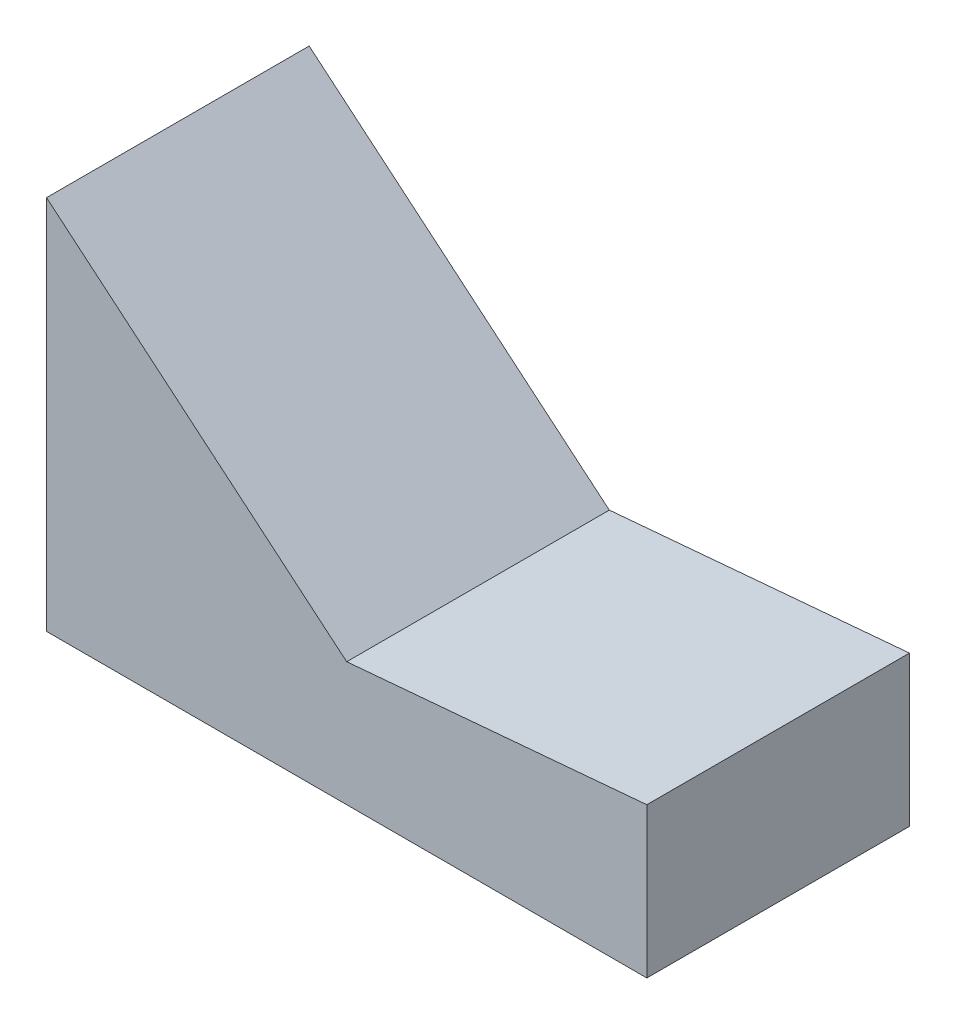
ISO-10303-21;
HEADER;
FILE_DESCRIPTION(('STEP AP214'),'2;1');
FILE_NAME('part.step','',(''),(''),'','','');
FILE_SCHEMA(('AUTOMOTIVE_DESIGN { 1 0 10303 214 1 1 1 1 }'));
ENDSEC;
DATA;
#1=APPLICATION_CONTEXT('core data for automotive mechanical design processes');
#2=APPLICATION_PROTOCOL_DEFINITION('international standard','automotive_design',2000,#1);
#3=PRODUCT_CONTEXT('',#1,'mechanical');
#4=PRODUCT('Part','Part','',(#3));
#5=PRODUCT_RELATED_PRODUCT_CATEGORY('part','',(#4));
#6=PRODUCT_DEFINITION_FORMATION('','',#4);
#7=PRODUCT_DEFINITION_CONTEXT('part definition',#1,'design');
#8=PRODUCT_DEFINITION('design','',#6,#7);
#9=PRODUCT_DEFINITION_SHAPE('','',#8);
#10=(LENGTH_UNIT() NAMED_UNIT(*) SI_UNIT(.MILLI.,.METRE.));
#11=(NAMED_UNIT(*) PLANE_ANGLE_UNIT() SI_UNIT($,.RADIAN.));
#12=(NAMED_UNIT(*) SI_UNIT($,.STERADIAN.) SOLID_ANGLE_UNIT());
#13=UNCERTAINTY_MEASURE_WITH_UNIT(LENGTH_MEASURE(1.E-05),#10,'distance_accuracy_value','');
#14=(GEOMETRIC_REPRESENTATION_CONTEXT(3) GLOBAL_UNCERTAINTY_ASSIGNED_CONTEXT((#13)) GLOBAL_UNIT_ASSIGNED_CONTEXT((#10,
#11,#12)) REPRESENTATION_CONTEXT('',''));
#15=CARTESIAN_POINT('',(0.,0.,0.));
#16=DIRECTION('',(0.,0.,1.));
#17=DIRECTION('',(1.,0.,0.));
#18=AXIS2_PLACEMENT_3D('',#15,#16,#17);
#19=CARTESIAN_POINT('',(0.,20.,35.));
#20=DIRECTION('',(-1.,0.,0.));
#21=DIRECTION('',(0.,-1.,0.));
#22=AXIS2_PLACEMENT_3D('',#19,#20,#21);
#23=PLANE('',#22);
#24=DIRECTION('',(0.,1.,0.));
#25=VECTOR('',#24,1.);
#26=CARTESIAN_POINT('',(0.,20.,0.));
#27=LINE('',#26,#25);
#28=CARTESIAN_POINT('',(0.,0.,0.));
#29=VERTEX_POINT('',#28);
#30=CARTESIAN_POINT('',(0.,20.,0.));
#31=VERTEX_POINT('',#30);
#32=EDGE_CURVE('E111',#29,#31,#27,.T.);
#33=ORIENTED_EDGE('',*,*,#32,.T.);
#34=DIRECTION('',(0.,0.,-1.));
#35=VECTOR('',#34,1.);
#36=CARTESIAN_POINT('',(0.,20.,35.));
#37=LINE('',#36,#35);
#38=CARTESIAN_POINT('',(0.,20.,35.));
#39=VERTEX_POINT('',#38);
#40=EDGE_CURVE('E11',#39,#31,#37,.T.);
#41=ORIENTED_EDGE('',*,*,#40,.F.);
#42=DIRECTION('',(0.,1.,0.));
#43=VECTOR('',#42,1.);
#44=CARTESIAN_POINT('',(0.,20.,35.));
#45=LINE('',#44,#43);
#46=CARTESIAN_POINT('',(0.,0.,35.));
#47=VERTEX_POINT('',#46);
#48=EDGE_CURVE('E119',#47,#39,#45,.T.);
#49=ORIENTED_EDGE('',*,*,#48,.F.);
#50=DIRECTION('',(0.,0.,-1.));
#51=VECTOR('',#50,1.);
#52=CARTESIAN_POINT('',(0.,0.,35.));
#53=LINE('',#52,#51);
#54=EDGE_CURVE('E107',#47,#29,#53,.T.);
#55=ORIENTED_EDGE('',*,*,#54,.T.);
#56=EDGE_LOOP('',(#33,#41,#49,#55));
#57=FACE_BOUND('',#56,.T.);
#58=ADVANCED_FACE('F37',(#57),#23,.F.);
#59=CARTESIAN_POINT('',(-40.,16.5004534589629,35.));
#60=DIRECTION('',(0.087155742747662,-0.996194698091745,0.));
#61=DIRECTION('',(0.996194698091745,0.087155742747662,0.));
#62=AXIS2_PLACEMENT_3D('',#59,#60,#61);
#63=PLANE('',#62);
#64=DIRECTION('',(-0.996194698091745,-0.087155742747662,0.));
#65=VECTOR('',#64,1.);
#66=CARTESIAN_POINT('',(-40.,16.5004534589629,0.));
#67=LINE('',#66,#65);
#68=CARTESIAN_POINT('',(-40.,16.5004534589629,0.));
#69=VERTEX_POINT('',#68);
#70=EDGE_CURVE('E114',#31,#69,#67,.T.);
#71=ORIENTED_EDGE('',*,*,#70,.T.);
#72=DIRECTION('',(0.,0.,-1.));
#73=VECTOR('',#72,1.);
#74=CARTESIAN_POINT('',(-40.,16.5004534589629,35.));
#75=LINE('',#74,#73);
#76=CARTESIAN_POINT('',(-40.,16.5004534589629,35.));
#77=VERTEX_POINT('',#76);
#78=EDGE_CURVE('E45',#77,#69,#75,.T.);
#79=ORIENTED_EDGE('',*,*,#78,.F.);
#80=DIRECTION('',(-0.996194698091745,-0.087155742747662,0.));
#81=VECTOR('',#80,1.);
#82=CARTESIAN_POINT('',(-40.,16.5004534589629,35.));
#83=LINE('',#82,#81);
#84=EDGE_CURVE('E87',#39,#77,#83,.T.);
#85=ORIENTED_EDGE('',*,*,#84,.F.);
#86=ORIENTED_EDGE('',*,*,#40,.T.);
#87=EDGE_LOOP('',(#71,#79,#85,#86));
#88=FACE_BOUND('',#87,.T.);
#89=ADVANCED_FACE('F138',(#88),#63,.F.);
#90=CARTESIAN_POINT('',(-80.,50.0644387060545,35.));
#91=DIRECTION('',(-0.642787609686544,-0.766044443118975,0.));
#92=DIRECTION('',(0.766044443118975,-0.642787609686544,0.));
#93=AXIS2_PLACEMENT_3D('',#90,#91,#92);
#94=PLANE('',#93);
#95=DIRECTION('',(-0.766044443118975,0.642787609686544,0.));
#96=VECTOR('',#95,1.);
#97=CARTESIAN_POINT('',(-80.,50.0644387060545,0.));
#98=LINE('',#97,#96);
#99=CARTESIAN_POINT('',(-80.,50.0644387060545,0.));
#100=VERTEX_POINT('',#99);
#101=EDGE_CURVE('E102',#69,#100,#98,.T.);
#102=ORIENTED_EDGE('',*,*,#101,.T.);
#103=DIRECTION('',(0.,0.,-1.));
#104=VECTOR('',#103,1.);
#105=CARTESIAN_POINT('',(-80.,50.0644387060545,35.));
#106=LINE('',#105,#104);
#107=CARTESIAN_POINT('',(-80.,50.0644387060545,35.));
#108=VERTEX_POINT('',#107);
#109=EDGE_CURVE('E99',#108,#100,#106,.T.);
#110=ORIENTED_EDGE('',*,*,#109,.F.);
#111=DIRECTION('',(-0.766044443118975,0.642787609686544,0.));
#112=VECTOR('',#111,1.);
#113=CARTESIAN_POINT('',(-80.,50.0644387060545,35.));
#114=LINE('',#113,#112);
#115=EDGE_CURVE('E91',#77,#108,#114,.T.);
#116=ORIENTED_EDGE('',*,*,#115,.F.);
#117=ORIENTED_EDGE('',*,*,#78,.T.);
#118=EDGE_LOOP('',(#102,#110,#116,#117));
#119=FACE_BOUND('',#118,.T.);
#120=ADVANCED_FACE('F100',(#119),#94,.F.);
#121=CARTESIAN_POINT('',(-80.,0.,35.));
#122=DIRECTION('',(1.,0.,0.));
#123=DIRECTION('',(0.,0.,-1.));
#124=AXIS2_PLACEMENT_3D('',#121,#122,#123);
#125=PLANE('',#124);
#126=DIRECTION('',(0.,-1.,0.));
#127=VECTOR('',#126,1.);
#128=CARTESIAN_POINT('',(-80.,0.,0.));
#129=LINE('',#128,#127);
#130=CARTESIAN_POINT('',(-80.,0.,0.));
#131=VERTEX_POINT('',#130);
#132=EDGE_CURVE('E73',#100,#131,#129,.T.);
#133=ORIENTED_EDGE('',*,*,#132,.T.);
#134=DIRECTION('',(0.,0.,-1.));
#135=VECTOR('',#134,1.);
#136=CARTESIAN_POINT('',(-80.,0.,35.));
#137=LINE('',#136,#135);
#138=CARTESIAN_POINT('',(-80.,0.,35.));
#139=VERTEX_POINT('',#138);
#140=EDGE_CURVE('E103',#139,#131,#137,.T.);
#141=ORIENTED_EDGE('',*,*,#140,.F.);
#142=DIRECTION('',(0.,-1.,0.));
#143=VECTOR('',#142,1.);
#144=CARTESIAN_POINT('',(-80.,0.,35.));
#145=LINE('',#144,#143);
#146=EDGE_CURVE('E95',#108,#139,#145,.T.);
#147=ORIENTED_EDGE('',*,*,#146,.F.);
#148=ORIENTED_EDGE('',*,*,#109,.T.);
#149=EDGE_LOOP('',(#133,#141,#147,#148));
#150=FACE_BOUND('',#149,.T.);
#151=ADVANCED_FACE('F105',(#150),#125,.F.);
#152=CARTESIAN_POINT('',(0.,0.,35.));
#153=DIRECTION('',(0.,1.,0.));
#154=DIRECTION('',(0.,0.,1.));
#155=AXIS2_PLACEMENT_3D('',#152,#153,#154);
#156=PLANE('',#155);
#157=DIRECTION('',(1.,0.,0.));
#158=VECTOR('',#157,1.);
#159=CARTESIAN_POINT('',(0.,0.,0.));
#160=LINE('',#159,#158);
#161=EDGE_CURVE('E79',#131,#29,#160,.T.);
#162=ORIENTED_EDGE('',*,*,#161,.T.);
#163=ORIENTED_EDGE('',*,*,#54,.F.);
#164=DIRECTION('',(1.,0.,0.));
#165=VECTOR('',#164,1.);
#166=CARTESIAN_POINT('',(0.,0.,35.));
#167=LINE('',#166,#165);
#168=EDGE_CURVE('E53',#139,#47,#167,.T.);
#169=ORIENTED_EDGE('',*,*,#168,.F.);
#170=ORIENTED_EDGE('',*,*,#140,.T.);
#171=EDGE_LOOP('',(#162,#163,#169,#170));
#172=FACE_BOUND('',#171,.T.);
#173=ADVANCED_FACE('F127',(#172),#156,.F.);
#174=CARTESIAN_POINT('',(0.,0.,35.));
#175=DIRECTION('',(0.,0.,-1.));
#176=DIRECTION('',(-1.,0.,0.));
#177=AXIS2_PLACEMENT_3D('',#174,#175,#176);
#178=PLANE('',#177);
#179=ORIENTED_EDGE('',*,*,#48,.T.);
#180=ORIENTED_EDGE('',*,*,#84,.T.);
#181=ORIENTED_EDGE('',*,*,#115,.T.);
#182=ORIENTED_EDGE('',*,*,#146,.T.);
#183=ORIENTED_EDGE('',*,*,#168,.T.);
#184=EDGE_LOOP('',(#179,#180,#181,#182,#183));
#185=FACE_BOUND('',#184,.T.);
#186=ADVANCED_FACE('F93',(#185),#178,.F.);
#187=CARTESIAN_POINT('',(0.,0.,0.));
#188=DIRECTION('',(0.,0.,-1.));
#189=DIRECTION('',(-1.,0.,0.));
#190=AXIS2_PLACEMENT_3D('',#187,#188,#189);
#191=PLANE('',#190);
#192=ORIENTED_EDGE('',*,*,#32,.F.);
#193=ORIENTED_EDGE('',*,*,#161,.F.);
#194=ORIENTED_EDGE('',*,*,#132,.F.);
#195=ORIENTED_EDGE('',*,*,#101,.F.);
#196=ORIENTED_EDGE('',*,*,#70,.F.);
#197=EDGE_LOOP('',(#192,#193,#194,#195,#196));
#198=FACE_BOUND('',#197,.T.);
#199=ADVANCED_FACE('F123',(#198),#191,.T.);
#200=CLOSED_SHELL('',(#58,#89,#120,#151,#173,#186,#199));
#201=MANIFOLD_SOLID_BREP('B2',#200);
#202=ADVANCED_BREP_SHAPE_REPRESENTATION('',(#18,#201),#14);
#203=SHAPE_DEFINITION_REPRESENTATION(#9,#202);
ENDSEC;
END-ISO-10303-21;
